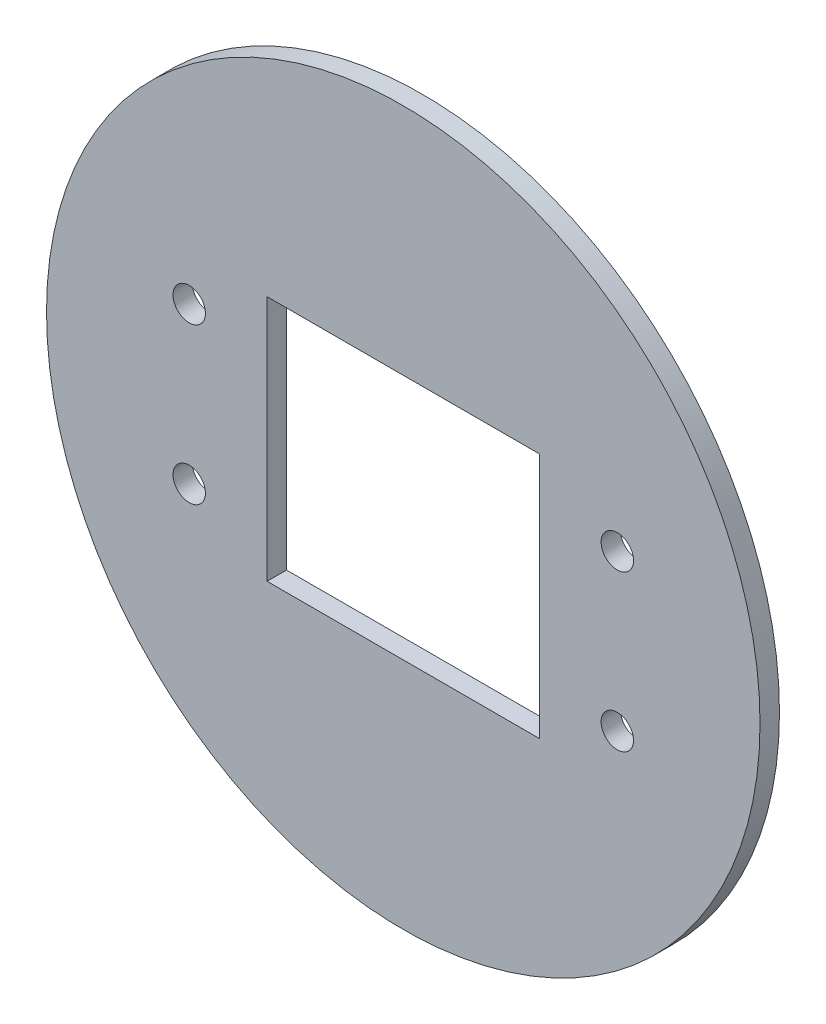
ISO-10303-21;
HEADER;
FILE_DESCRIPTION(('STEP AP214'),'2;1');
FILE_NAME('part.step','',(''),(''),'','','');
FILE_SCHEMA(('AUTOMOTIVE_DESIGN { 1 0 10303 214 1 1 1 1 }'));
ENDSEC;
DATA;
#1=APPLICATION_CONTEXT('core data for automotive mechanical design processes');
#2=APPLICATION_PROTOCOL_DEFINITION('international standard','automotive_design',2000,#1);
#3=PRODUCT_CONTEXT('',#1,'mechanical');
#4=PRODUCT('Part','Part','',(#3));
#5=PRODUCT_RELATED_PRODUCT_CATEGORY('part','',(#4));
#6=PRODUCT_DEFINITION_FORMATION('','',#4);
#7=PRODUCT_DEFINITION_CONTEXT('part definition',#1,'design');
#8=PRODUCT_DEFINITION('design','',#6,#7);
#9=PRODUCT_DEFINITION_SHAPE('','',#8);
#10=(LENGTH_UNIT() NAMED_UNIT(*) SI_UNIT(.MILLI.,.METRE.));
#11=(NAMED_UNIT(*) PLANE_ANGLE_UNIT() SI_UNIT($,.RADIAN.));
#12=(NAMED_UNIT(*) SI_UNIT($,.STERADIAN.) SOLID_ANGLE_UNIT());
#13=UNCERTAINTY_MEASURE_WITH_UNIT(LENGTH_MEASURE(1.E-05),#10,'distance_accuracy_value','');
#14=(GEOMETRIC_REPRESENTATION_CONTEXT(3) GLOBAL_UNCERTAINTY_ASSIGNED_CONTEXT((#13)) GLOBAL_UNIT_ASSIGNED_CONTEXT((#10,
#11,#12)) REPRESENTATION_CONTEXT('',''));
#15=CARTESIAN_POINT('',(0.,0.,0.));
#16=DIRECTION('',(0.,0.,1.));
#17=DIRECTION('',(1.,0.,0.));
#18=AXIS2_PLACEMENT_3D('',#15,#16,#17);
#19=CARTESIAN_POINT('',(0.,0.,1.5));
#20=DIRECTION('',(0.,0.,-1.));
#21=DIRECTION('',(-1.,0.,0.));
#22=AXIS2_PLACEMENT_3D('',#19,#20,#21);
#23=CYLINDRICAL_SURFACE('',#22,27.5);
#24=CARTESIAN_POINT('',(0.,0.,1.5));
#25=DIRECTION('',(0.,0.,1.));
#26=DIRECTION('',(1.,0.,0.));
#27=AXIS2_PLACEMENT_3D('',#24,#25,#26);
#28=CIRCLE('',#27,27.5);
#29=CARTESIAN_POINT('',(27.5,0.,1.5));
#30=VERTEX_POINT('',#29);
#31=EDGE_CURVE('E12',#30,#30,#28,.T.);
#32=ORIENTED_EDGE('',*,*,#31,.F.);
#33=EDGE_LOOP('',(#32));
#34=FACE_BOUND('',#33,.T.);
#35=CARTESIAN_POINT('',(0.,0.,0.));
#36=DIRECTION('',(0.,0.,1.));
#37=DIRECTION('',(1.,0.,0.));
#38=AXIS2_PLACEMENT_3D('',#35,#36,#37);
#39=CIRCLE('',#38,27.5);
#40=CARTESIAN_POINT('',(27.5,0.,0.));
#41=VERTEX_POINT('',#40);
#42=EDGE_CURVE('E58',#41,#41,#39,.T.);
#43=ORIENTED_EDGE('',*,*,#42,.T.);
#44=EDGE_LOOP('',(#43));
#45=FACE_BOUND('',#44,.T.);
#46=ADVANCED_FACE('F50',(#34,#45),#23,.T.);
#47=CARTESIAN_POINT('',(0.,0.,1.5));
#48=DIRECTION('',(0.,0.,1.));
#49=DIRECTION('',(1.,0.,0.));
#50=AXIS2_PLACEMENT_3D('',#47,#48,#49);
#51=PLANE('',#50);
#52=CARTESIAN_POINT('',(-16.5,6.,1.5));
#53=DIRECTION('',(0.,0.,1.));
#54=DIRECTION('',(-1.,0.,0.));
#55=AXIS2_PLACEMENT_3D('',#52,#53,#54);
#56=CIRCLE('',#55,1.25);
#57=CARTESIAN_POINT('',(-17.75,6.,1.5));
#58=VERTEX_POINT('',#57);
#59=EDGE_CURVE('E202',#58,#58,#56,.T.);
#60=ORIENTED_EDGE('',*,*,#59,.F.);
#61=EDGE_LOOP('',(#60));
#62=FACE_BOUND('',#61,.T.);
#63=CARTESIAN_POINT('',(16.5,-6.,1.5));
#64=DIRECTION('',(0.,0.,1.));
#65=DIRECTION('',(-1.,0.,0.));
#66=AXIS2_PLACEMENT_3D('',#63,#64,#65);
#67=CIRCLE('',#66,1.25);
#68=CARTESIAN_POINT('',(15.25,-6.,1.5));
#69=VERTEX_POINT('',#68);
#70=EDGE_CURVE('E203',#69,#69,#67,.T.);
#71=ORIENTED_EDGE('',*,*,#70,.F.);
#72=EDGE_LOOP('',(#71));
#73=FACE_BOUND('',#72,.T.);
#74=CARTESIAN_POINT('',(-16.5,-6.,1.5));
#75=DIRECTION('',(0.,0.,1.));
#76=DIRECTION('',(1.,0.,0.));
#77=AXIS2_PLACEMENT_3D('',#74,#75,#76);
#78=CIRCLE('',#77,1.25);
#79=CARTESIAN_POINT('',(-15.25,-6.,1.5));
#80=VERTEX_POINT('',#79);
#81=EDGE_CURVE('E207',#80,#80,#78,.T.);
#82=ORIENTED_EDGE('',*,*,#81,.F.);
#83=EDGE_LOOP('',(#82));
#84=FACE_BOUND('',#83,.T.);
#85=CARTESIAN_POINT('',(16.5,6.,1.5));
#86=DIRECTION('',(0.,0.,1.));
#87=DIRECTION('',(1.,0.,0.));
#88=AXIS2_PLACEMENT_3D('',#85,#86,#87);
#89=CIRCLE('',#88,1.25);
#90=CARTESIAN_POINT('',(17.75,6.,1.5));
#91=VERTEX_POINT('',#90);
#92=EDGE_CURVE('E114',#91,#91,#89,.T.);
#93=ORIENTED_EDGE('',*,*,#92,.F.);
#94=EDGE_LOOP('',(#93));
#95=FACE_BOUND('',#94,.T.);
#96=DIRECTION('',(1.,0.,0.));
#97=VECTOR('',#96,1.);
#98=CARTESIAN_POINT('',(-10.5,9.5,1.5));
#99=LINE('',#98,#97);
#100=CARTESIAN_POINT('',(-10.5,9.5,1.5));
#101=VERTEX_POINT('',#100);
#102=CARTESIAN_POINT('',(10.5,9.5,1.5));
#103=VERTEX_POINT('',#102);
#104=EDGE_CURVE('E94',#101,#103,#99,.T.);
#105=ORIENTED_EDGE('',*,*,#104,.T.);
#106=DIRECTION('',(0.,-1.,0.));
#107=VECTOR('',#106,1.);
#108=CARTESIAN_POINT('',(10.5,9.5,1.5));
#109=LINE('',#108,#107);
#110=CARTESIAN_POINT('',(10.5,-9.5,1.5));
#111=VERTEX_POINT('',#110);
#112=EDGE_CURVE('E100',#103,#111,#109,.T.);
#113=ORIENTED_EDGE('',*,*,#112,.T.);
#114=DIRECTION('',(1.,0.,0.));
#115=VECTOR('',#114,1.);
#116=CARTESIAN_POINT('',(-10.5,-9.5,1.5));
#117=LINE('',#116,#115);
#118=CARTESIAN_POINT('',(-10.5,-9.5,1.5));
#119=VERTEX_POINT('',#118);
#120=EDGE_CURVE('E104',#119,#111,#117,.T.);
#121=ORIENTED_EDGE('',*,*,#120,.F.);
#122=DIRECTION('',(0.,-1.,0.));
#123=VECTOR('',#122,1.);
#124=CARTESIAN_POINT('',(-10.5,9.5,1.5));
#125=LINE('',#124,#123);
#126=EDGE_CURVE('E97',#101,#119,#125,.T.);
#127=ORIENTED_EDGE('',*,*,#126,.F.);
#128=EDGE_LOOP('',(#105,#113,#121,#127));
#129=FACE_BOUND('',#128,.T.);
#130=ORIENTED_EDGE('',*,*,#31,.T.);
#131=EDGE_LOOP('',(#130));
#132=FACE_BOUND('',#131,.T.);
#133=ADVANCED_FACE('F106',(#62,#73,#84,#95,#129,#132),#51,.T.);
#134=CARTESIAN_POINT('',(0.,0.,0.));
#135=DIRECTION('',(0.,0.,1.));
#136=DIRECTION('',(1.,0.,0.));
#137=AXIS2_PLACEMENT_3D('',#134,#135,#136);
#138=PLANE('',#137);
#139=CARTESIAN_POINT('',(-16.5,6.,0.));
#140=DIRECTION('',(0.,0.,1.));
#141=DIRECTION('',(1.,0.,0.));
#142=AXIS2_PLACEMENT_3D('',#139,#140,#141);
#143=CIRCLE('',#142,1.25);
#144=CARTESIAN_POINT('',(-15.25,6.,0.));
#145=VERTEX_POINT('',#144);
#146=EDGE_CURVE('E53',#145,#145,#143,.T.);
#147=ORIENTED_EDGE('',*,*,#146,.T.);
#148=EDGE_LOOP('',(#147));
#149=FACE_BOUND('',#148,.T.);
#150=CARTESIAN_POINT('',(16.5,-6.,0.));
#151=DIRECTION('',(0.,0.,1.));
#152=DIRECTION('',(1.,0.,0.));
#153=AXIS2_PLACEMENT_3D('',#150,#151,#152);
#154=CIRCLE('',#153,1.25);
#155=CARTESIAN_POINT('',(17.75,-6.,0.));
#156=VERTEX_POINT('',#155);
#157=EDGE_CURVE('E136',#156,#156,#154,.T.);
#158=ORIENTED_EDGE('',*,*,#157,.T.);
#159=EDGE_LOOP('',(#158));
#160=FACE_BOUND('',#159,.T.);
#161=CARTESIAN_POINT('',(-16.5,-6.,0.));
#162=DIRECTION('',(0.,0.,1.));
#163=DIRECTION('',(1.,0.,0.));
#164=AXIS2_PLACEMENT_3D('',#161,#162,#163);
#165=CIRCLE('',#164,1.25);
#166=CARTESIAN_POINT('',(-15.25,-6.,0.));
#167=VERTEX_POINT('',#166);
#168=EDGE_CURVE('E134',#167,#167,#165,.T.);
#169=ORIENTED_EDGE('',*,*,#168,.T.);
#170=EDGE_LOOP('',(#169));
#171=FACE_BOUND('',#170,.T.);
#172=CARTESIAN_POINT('',(16.5,6.,0.));
#173=DIRECTION('',(0.,0.,1.));
#174=DIRECTION('',(1.,0.,0.));
#175=AXIS2_PLACEMENT_3D('',#172,#173,#174);
#176=CIRCLE('',#175,1.25);
#177=CARTESIAN_POINT('',(17.75,6.,0.));
#178=VERTEX_POINT('',#177);
#179=EDGE_CURVE('E131',#178,#178,#176,.T.);
#180=ORIENTED_EDGE('',*,*,#179,.T.);
#181=EDGE_LOOP('',(#180));
#182=FACE_BOUND('',#181,.T.);
#183=DIRECTION('',(0.,-1.,0.));
#184=VECTOR('',#183,1.);
#185=CARTESIAN_POINT('',(10.5,9.5,0.));
#186=LINE('',#185,#184);
#187=CARTESIAN_POINT('',(10.5,9.5,0.));
#188=VERTEX_POINT('',#187);
#189=CARTESIAN_POINT('',(10.5,-9.5,0.));
#190=VERTEX_POINT('',#189);
#191=EDGE_CURVE('E120',#188,#190,#186,.T.);
#192=ORIENTED_EDGE('',*,*,#191,.F.);
#193=DIRECTION('',(1.,0.,0.));
#194=VECTOR('',#193,1.);
#195=CARTESIAN_POINT('',(-10.5,9.5,0.));
#196=LINE('',#195,#194);
#197=CARTESIAN_POINT('',(-10.5,9.5,0.));
#198=VERTEX_POINT('',#197);
#199=EDGE_CURVE('E74',#198,#188,#196,.T.);
#200=ORIENTED_EDGE('',*,*,#199,.F.);
#201=DIRECTION('',(0.,-1.,0.));
#202=VECTOR('',#201,1.);
#203=CARTESIAN_POINT('',(-10.5,9.5,0.));
#204=LINE('',#203,#202);
#205=CARTESIAN_POINT('',(-10.5,-9.5,0.));
#206=VERTEX_POINT('',#205);
#207=EDGE_CURVE('E108',#198,#206,#204,.T.);
#208=ORIENTED_EDGE('',*,*,#207,.T.);
#209=DIRECTION('',(1.,0.,0.));
#210=VECTOR('',#209,1.);
#211=CARTESIAN_POINT('',(-10.5,-9.5,0.));
#212=LINE('',#211,#210);
#213=EDGE_CURVE('E111',#206,#190,#212,.T.);
#214=ORIENTED_EDGE('',*,*,#213,.T.);
#215=EDGE_LOOP('',(#192,#200,#208,#214));
#216=FACE_BOUND('',#215,.T.);
#217=ORIENTED_EDGE('',*,*,#42,.F.);
#218=EDGE_LOOP('',(#217));
#219=FACE_BOUND('',#218,.T.);
#220=ADVANCED_FACE('F143',(#149,#160,#171,#182,#216,#219),#138,.F.);
#221=CARTESIAN_POINT('',(-10.5,9.5,1.5));
#222=DIRECTION('',(0.,1.,0.));
#223=DIRECTION('',(0.,0.,1.));
#224=AXIS2_PLACEMENT_3D('',#221,#222,#223);
#225=PLANE('',#224);
#226=ORIENTED_EDGE('',*,*,#199,.T.);
#227=DIRECTION('',(0.,0.,-1.));
#228=VECTOR('',#227,1.);
#229=CARTESIAN_POINT('',(10.5,9.5,1.5));
#230=LINE('',#229,#228);
#231=EDGE_CURVE('E91',#103,#188,#230,.T.);
#232=ORIENTED_EDGE('',*,*,#231,.F.);
#233=ORIENTED_EDGE('',*,*,#104,.F.);
#234=DIRECTION('',(0.,0.,-1.));
#235=VECTOR('',#234,1.);
#236=CARTESIAN_POINT('',(-10.5,9.5,1.5));
#237=LINE('',#236,#235);
#238=EDGE_CURVE('E124',#101,#198,#237,.T.);
#239=ORIENTED_EDGE('',*,*,#238,.T.);
#240=EDGE_LOOP('',(#226,#232,#233,#239));
#241=FACE_BOUND('',#240,.T.);
#242=ADVANCED_FACE('F92',(#241),#225,.F.);
#243=CARTESIAN_POINT('',(-10.5,9.5,1.5));
#244=DIRECTION('',(1.,0.,0.));
#245=DIRECTION('',(0.,1.,0.));
#246=AXIS2_PLACEMENT_3D('',#243,#244,#245);
#247=PLANE('',#246);
#248=ORIENTED_EDGE('',*,*,#207,.F.);
#249=ORIENTED_EDGE('',*,*,#238,.F.);
#250=ORIENTED_EDGE('',*,*,#126,.T.);
#251=DIRECTION('',(0.,0.,-1.));
#252=VECTOR('',#251,1.);
#253=CARTESIAN_POINT('',(-10.5,-9.5,1.5));
#254=LINE('',#253,#252);
#255=EDGE_CURVE('E126',#119,#206,#254,.T.);
#256=ORIENTED_EDGE('',*,*,#255,.T.);
#257=EDGE_LOOP('',(#248,#249,#250,#256));
#258=FACE_BOUND('',#257,.T.);
#259=ADVANCED_FACE('F173',(#258),#247,.T.);
#260=CARTESIAN_POINT('',(-10.5,-9.5,1.5));
#261=DIRECTION('',(0.,1.,0.));
#262=DIRECTION('',(0.,0.,1.));
#263=AXIS2_PLACEMENT_3D('',#260,#261,#262);
#264=PLANE('',#263);
#265=ORIENTED_EDGE('',*,*,#213,.F.);
#266=ORIENTED_EDGE('',*,*,#255,.F.);
#267=ORIENTED_EDGE('',*,*,#120,.T.);
#268=DIRECTION('',(0.,0.,-1.));
#269=VECTOR('',#268,1.);
#270=CARTESIAN_POINT('',(10.5,-9.5,1.5));
#271=LINE('',#270,#269);
#272=EDGE_CURVE('E66',#111,#190,#271,.T.);
#273=ORIENTED_EDGE('',*,*,#272,.T.);
#274=EDGE_LOOP('',(#265,#266,#267,#273));
#275=FACE_BOUND('',#274,.T.);
#276=ADVANCED_FACE('F179',(#275),#264,.T.);
#277=CARTESIAN_POINT('',(10.5,9.5,1.5));
#278=DIRECTION('',(1.,0.,0.));
#279=DIRECTION('',(0.,1.,0.));
#280=AXIS2_PLACEMENT_3D('',#277,#278,#279);
#281=PLANE('',#280);
#282=ORIENTED_EDGE('',*,*,#191,.T.);
#283=ORIENTED_EDGE('',*,*,#272,.F.);
#284=ORIENTED_EDGE('',*,*,#112,.F.);
#285=ORIENTED_EDGE('',*,*,#231,.T.);
#286=EDGE_LOOP('',(#282,#283,#284,#285));
#287=FACE_BOUND('',#286,.T.);
#288=ADVANCED_FACE('F101',(#287),#281,.F.);
#289=CARTESIAN_POINT('',(16.5,6.,-8.5));
#290=DIRECTION('',(0.,0.,1.));
#291=DIRECTION('',(1.,0.,0.));
#292=AXIS2_PLACEMENT_3D('',#289,#290,#291);
#293=CYLINDRICAL_SURFACE('',#292,1.25);
#294=ORIENTED_EDGE('',*,*,#92,.T.);
#295=EDGE_LOOP('',(#294));
#296=FACE_BOUND('',#295,.T.);
#297=ORIENTED_EDGE('',*,*,#179,.F.);
#298=EDGE_LOOP('',(#297));
#299=FACE_BOUND('',#298,.T.);
#300=ADVANCED_FACE('F178',(#296,#299),#293,.F.);
#301=CARTESIAN_POINT('',(-16.5,-6.,-8.5));
#302=DIRECTION('',(0.,0.,1.));
#303=DIRECTION('',(1.,0.,0.));
#304=AXIS2_PLACEMENT_3D('',#301,#302,#303);
#305=CYLINDRICAL_SURFACE('',#304,1.25);
#306=ORIENTED_EDGE('',*,*,#81,.T.);
#307=EDGE_LOOP('',(#306));
#308=FACE_BOUND('',#307,.T.);
#309=ORIENTED_EDGE('',*,*,#168,.F.);
#310=EDGE_LOOP('',(#309));
#311=FACE_BOUND('',#310,.T.);
#312=ADVANCED_FACE('F153',(#308,#311),#305,.F.);
#313=CARTESIAN_POINT('',(16.5,-6.,-8.5));
#314=DIRECTION('',(0.,0.,1.));
#315=DIRECTION('',(1.,0.,0.));
#316=AXIS2_PLACEMENT_3D('',#313,#314,#315);
#317=CYLINDRICAL_SURFACE('',#316,1.25);
#318=ORIENTED_EDGE('',*,*,#70,.T.);
#319=EDGE_LOOP('',(#318));
#320=FACE_BOUND('',#319,.T.);
#321=ORIENTED_EDGE('',*,*,#157,.F.);
#322=EDGE_LOOP('',(#321));
#323=FACE_BOUND('',#322,.T.);
#324=ADVANCED_FACE('F147',(#320,#323),#317,.F.);
#325=CARTESIAN_POINT('',(-16.5,6.,-8.5));
#326=DIRECTION('',(0.,0.,1.));
#327=DIRECTION('',(1.,0.,0.));
#328=AXIS2_PLACEMENT_3D('',#325,#326,#327);
#329=CYLINDRICAL_SURFACE('',#328,1.25);
#330=ORIENTED_EDGE('',*,*,#59,.T.);
#331=EDGE_LOOP('',(#330));
#332=FACE_BOUND('',#331,.T.);
#333=ORIENTED_EDGE('',*,*,#146,.F.);
#334=EDGE_LOOP('',(#333));
#335=FACE_BOUND('',#334,.T.);
#336=ADVANCED_FACE('F145',(#332,#335),#329,.F.);
#337=CLOSED_SHELL('',(#46,#133,#220,#242,#259,#276,#288,#300,#312,#324,#336));
#338=MANIFOLD_SOLID_BREP('B2',#337);
#339=ADVANCED_BREP_SHAPE_REPRESENTATION('',(#18,#338),#14);
#340=SHAPE_DEFINITION_REPRESENTATION(#9,#339);
ENDSEC;
END-ISO-10303-21;
